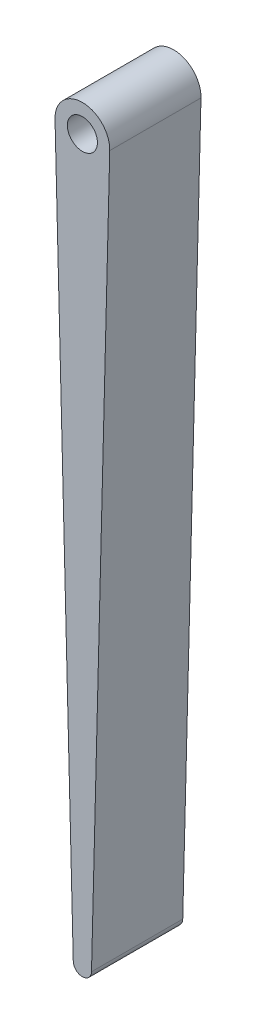
ISO-10303-21;
HEADER;
FILE_DESCRIPTION(('STEP AP214'),'2;1');
FILE_NAME('part.step','',(''),(''),'','','');
FILE_SCHEMA(('AUTOMOTIVE_DESIGN { 1 0 10303 214 1 1 1 1 }'));
ENDSEC;
DATA;
#1=APPLICATION_CONTEXT('core data for automotive mechanical design processes');
#2=APPLICATION_PROTOCOL_DEFINITION('international standard','automotive_design',2000,#1);
#3=PRODUCT_CONTEXT('',#1,'mechanical');
#4=PRODUCT('Part','Part','',(#3));
#5=PRODUCT_RELATED_PRODUCT_CATEGORY('part','',(#4));
#6=PRODUCT_DEFINITION_FORMATION('','',#4);
#7=PRODUCT_DEFINITION_CONTEXT('part definition',#1,'design');
#8=PRODUCT_DEFINITION('design','',#6,#7);
#9=PRODUCT_DEFINITION_SHAPE('','',#8);
#10=(LENGTH_UNIT() NAMED_UNIT(*) SI_UNIT(.MILLI.,.METRE.));
#11=(NAMED_UNIT(*) PLANE_ANGLE_UNIT() SI_UNIT($,.RADIAN.));
#12=(NAMED_UNIT(*) SI_UNIT($,.STERADIAN.) SOLID_ANGLE_UNIT());
#13=UNCERTAINTY_MEASURE_WITH_UNIT(LENGTH_MEASURE(1.E-05),#10,'distance_accuracy_value','');
#14=(GEOMETRIC_REPRESENTATION_CONTEXT(3) GLOBAL_UNCERTAINTY_ASSIGNED_CONTEXT((#13)) GLOBAL_UNIT_ASSIGNED_CONTEXT((#10,
#11,#12)) REPRESENTATION_CONTEXT('',''));
#15=CARTESIAN_POINT('',(0.,0.,0.));
#16=DIRECTION('',(0.,0.,1.));
#17=DIRECTION('',(1.,0.,0.));
#18=AXIS2_PLACEMENT_3D('',#15,#16,#17);
#19=CARTESIAN_POINT('',(0.,0.,20.));
#20=DIRECTION('',(0.,0.,1.));
#21=DIRECTION('',(1.,0.,0.));
#22=AXIS2_PLACEMENT_3D('',#19,#20,#21);
#23=PLANE('',#22);
#24=CARTESIAN_POINT('',(0.,0.,20.));
#25=DIRECTION('',(0.,0.,1.));
#26=DIRECTION('',(1.,0.,0.));
#27=AXIS2_PLACEMENT_3D('',#24,#25,#26);
#28=CIRCLE('',#27,6.);
#29=CARTESIAN_POINT('',(5.99807692302753,-0.151898734177215,20.));
#30=VERTEX_POINT('',#29);
#31=CARTESIAN_POINT('',(-5.99807692302753,-0.151898734177217,20.));
#32=VERTEX_POINT('',#31);
#33=EDGE_CURVE('E91',#30,#32,#28,.T.);
#34=ORIENTED_EDGE('',*,*,#33,.T.);
#35=DIRECTION('',(0.0253164556962027,-0.999679487171254,0.));
#36=VECTOR('',#35,1.);
#37=CARTESIAN_POINT('',(-5.99807692302753,-0.151898734177217,20.));
#38=LINE('',#37,#36);
#39=CARTESIAN_POINT('',(-1.99935897434249,-158.050632911392,20.));
#40=VERTEX_POINT('',#39);
#41=EDGE_CURVE('E86',#32,#40,#38,.T.);
#42=ORIENTED_EDGE('',*,*,#41,.T.);
#43=CARTESIAN_POINT('',(0.,-158.,20.));
#44=DIRECTION('',(0.,0.,1.));
#45=DIRECTION('',(1.,0.,0.));
#46=AXIS2_PLACEMENT_3D('',#43,#44,#45);
#47=CIRCLE('',#46,2.);
#48=CARTESIAN_POINT('',(1.99935897434253,-158.050632911392,20.));
#49=VERTEX_POINT('',#48);
#50=EDGE_CURVE('E89',#40,#49,#47,.T.);
#51=ORIENTED_EDGE('',*,*,#50,.T.);
#52=DIRECTION('',(0.0253164556962024,0.999679487171254,0.));
#53=VECTOR('',#52,1.);
#54=CARTESIAN_POINT('',(5.99807692302753,-0.151898734177215,20.));
#55=LINE('',#54,#53);
#56=EDGE_CURVE('E56',#49,#30,#55,.T.);
#57=ORIENTED_EDGE('',*,*,#56,.T.);
#58=EDGE_LOOP('',(#34,#42,#51,#57));
#59=FACE_BOUND('',#58,.T.);
#60=CARTESIAN_POINT('',(0.,0.,20.));
#61=DIRECTION('',(0.,0.,1.));
#62=DIRECTION('',(1.,0.,0.));
#63=AXIS2_PLACEMENT_3D('',#60,#61,#62);
#64=CIRCLE('',#63,3.3);
#65=CARTESIAN_POINT('',(3.3,0.,20.));
#66=VERTEX_POINT('',#65);
#67=EDGE_CURVE('E106',#66,#66,#64,.T.);
#68=ORIENTED_EDGE('',*,*,#67,.F.);
#69=EDGE_LOOP('',(#68));
#70=FACE_BOUND('',#69,.T.);
#71=ADVANCED_FACE('F39',(#59,#70),#23,.T.);
#72=CARTESIAN_POINT('',(0.,0.,0.));
#73=DIRECTION('',(0.,0.,1.));
#74=DIRECTION('',(1.,0.,0.));
#75=AXIS2_PLACEMENT_3D('',#72,#73,#74);
#76=PLANE('',#75);
#77=CARTESIAN_POINT('',(0.,0.,0.));
#78=DIRECTION('',(0.,0.,1.));
#79=DIRECTION('',(1.,0.,0.));
#80=AXIS2_PLACEMENT_3D('',#77,#78,#79);
#81=CIRCLE('',#80,6.);
#82=CARTESIAN_POINT('',(5.99807692302753,-0.151898734177215,0.));
#83=VERTEX_POINT('',#82);
#84=CARTESIAN_POINT('',(-5.99807692302753,-0.151898734177217,0.));
#85=VERTEX_POINT('',#84);
#86=EDGE_CURVE('E103',#83,#85,#81,.T.);
#87=ORIENTED_EDGE('',*,*,#86,.F.);
#88=DIRECTION('',(0.0253164556962024,0.999679487171254,0.));
#89=VECTOR('',#88,1.);
#90=CARTESIAN_POINT('',(5.99807692302753,-0.151898734177215,0.));
#91=LINE('',#90,#89);
#92=CARTESIAN_POINT('',(1.99935897434253,-158.050632911392,0.));
#93=VERTEX_POINT('',#92);
#94=EDGE_CURVE('E79',#93,#83,#91,.T.);
#95=ORIENTED_EDGE('',*,*,#94,.F.);
#96=CARTESIAN_POINT('',(0.,-158.,0.));
#97=DIRECTION('',(0.,0.,1.));
#98=DIRECTION('',(1.,0.,0.));
#99=AXIS2_PLACEMENT_3D('',#96,#97,#98);
#100=CIRCLE('',#99,2.);
#101=CARTESIAN_POINT('',(-1.99935897434249,-158.050632911392,0.));
#102=VERTEX_POINT('',#101);
#103=EDGE_CURVE('E73',#102,#93,#100,.T.);
#104=ORIENTED_EDGE('',*,*,#103,.F.);
#105=DIRECTION('',(0.0253164556962027,-0.999679487171254,0.));
#106=VECTOR('',#105,1.);
#107=CARTESIAN_POINT('',(-5.99807692302753,-0.151898734177217,0.));
#108=LINE('',#107,#106);
#109=EDGE_CURVE('E95',#85,#102,#108,.T.);
#110=ORIENTED_EDGE('',*,*,#109,.F.);
#111=EDGE_LOOP('',(#87,#95,#104,#110));
#112=FACE_BOUND('',#111,.T.);
#113=CARTESIAN_POINT('',(0.,0.,0.));
#114=DIRECTION('',(0.,0.,1.));
#115=DIRECTION('',(1.,0.,0.));
#116=AXIS2_PLACEMENT_3D('',#113,#114,#115);
#117=CIRCLE('',#116,3.3);
#118=CARTESIAN_POINT('',(3.3,0.,0.));
#119=VERTEX_POINT('',#118);
#120=EDGE_CURVE('E118',#119,#119,#117,.T.);
#121=ORIENTED_EDGE('',*,*,#120,.T.);
#122=EDGE_LOOP('',(#121));
#123=FACE_BOUND('',#122,.T.);
#124=ADVANCED_FACE('F114',(#112,#123),#76,.F.);
#125=CARTESIAN_POINT('',(0.,0.,20.));
#126=DIRECTION('',(0.,0.,-1.));
#127=DIRECTION('',(-1.,0.,0.));
#128=AXIS2_PLACEMENT_3D('',#125,#126,#127);
#129=CYLINDRICAL_SURFACE('',#128,6.);
#130=ORIENTED_EDGE('',*,*,#86,.T.);
#131=DIRECTION('',(0.,0.,-1.));
#132=VECTOR('',#131,1.);
#133=CARTESIAN_POINT('',(-5.99807692302753,-0.151898734177217,20.));
#134=LINE('',#133,#132);
#135=EDGE_CURVE('E11',#32,#85,#134,.T.);
#136=ORIENTED_EDGE('',*,*,#135,.F.);
#137=ORIENTED_EDGE('',*,*,#33,.F.);
#138=DIRECTION('',(0.,0.,-1.));
#139=VECTOR('',#138,1.);
#140=CARTESIAN_POINT('',(5.99807692302753,-0.151898734177215,20.));
#141=LINE('',#140,#139);
#142=EDGE_CURVE('E99',#30,#83,#141,.T.);
#143=ORIENTED_EDGE('',*,*,#142,.T.);
#144=EDGE_LOOP('',(#130,#136,#137,#143));
#145=FACE_BOUND('',#144,.T.);
#146=ADVANCED_FACE('F41',(#145),#129,.T.);
#147=CARTESIAN_POINT('',(-5.99807692302753,-0.151898734177217,20.));
#148=DIRECTION('',(0.999679487171254,0.0253164556962027,0.));
#149=DIRECTION('',(-0.0253164556962027,0.999679487171254,0.));
#150=AXIS2_PLACEMENT_3D('',#147,#148,#149);
#151=PLANE('',#150);
#152=ORIENTED_EDGE('',*,*,#109,.T.);
#153=DIRECTION('',(0.,0.,-1.));
#154=VECTOR('',#153,1.);
#155=CARTESIAN_POINT('',(-1.99935897434249,-158.050632911392,20.));
#156=LINE('',#155,#154);
#157=EDGE_CURVE('E48',#40,#102,#156,.T.);
#158=ORIENTED_EDGE('',*,*,#157,.F.);
#159=ORIENTED_EDGE('',*,*,#41,.F.);
#160=ORIENTED_EDGE('',*,*,#135,.T.);
#161=EDGE_LOOP('',(#152,#158,#159,#160));
#162=FACE_BOUND('',#161,.T.);
#163=ADVANCED_FACE('F94',(#162),#151,.F.);
#164=CARTESIAN_POINT('',(0.,-158.,20.));
#165=DIRECTION('',(0.,0.,-1.));
#166=DIRECTION('',(-1.,0.,0.));
#167=AXIS2_PLACEMENT_3D('',#164,#165,#166);
#168=CYLINDRICAL_SURFACE('',#167,2.);
#169=ORIENTED_EDGE('',*,*,#103,.T.);
#170=DIRECTION('',(0.,0.,-1.));
#171=VECTOR('',#170,1.);
#172=CARTESIAN_POINT('',(1.99935897434253,-158.050632911392,20.));
#173=LINE('',#172,#171);
#174=EDGE_CURVE('E96',#49,#93,#173,.T.);
#175=ORIENTED_EDGE('',*,*,#174,.F.);
#176=ORIENTED_EDGE('',*,*,#50,.F.);
#177=ORIENTED_EDGE('',*,*,#157,.T.);
#178=EDGE_LOOP('',(#169,#175,#176,#177));
#179=FACE_BOUND('',#178,.T.);
#180=ADVANCED_FACE('F97',(#179),#168,.T.);
#181=CARTESIAN_POINT('',(5.99807692302753,-0.151898734177215,20.));
#182=DIRECTION('',(-0.999679487171254,0.0253164556962024,0.));
#183=DIRECTION('',(-0.0253164556962024,-0.999679487171254,0.));
#184=AXIS2_PLACEMENT_3D('',#181,#182,#183);
#185=PLANE('',#184);
#186=ORIENTED_EDGE('',*,*,#94,.T.);
#187=ORIENTED_EDGE('',*,*,#142,.F.);
#188=ORIENTED_EDGE('',*,*,#56,.F.);
#189=ORIENTED_EDGE('',*,*,#174,.T.);
#190=EDGE_LOOP('',(#186,#187,#188,#189));
#191=FACE_BOUND('',#190,.T.);
#192=ADVANCED_FACE('F111',(#191),#185,.F.);
#193=CARTESIAN_POINT('',(0.,0.,20.));
#194=DIRECTION('',(0.,0.,-1.));
#195=DIRECTION('',(-1.,0.,0.));
#196=AXIS2_PLACEMENT_3D('',#193,#194,#195);
#197=CYLINDRICAL_SURFACE('',#196,3.3);
#198=ORIENTED_EDGE('',*,*,#67,.T.);
#199=EDGE_LOOP('',(#198));
#200=FACE_BOUND('',#199,.T.);
#201=ORIENTED_EDGE('',*,*,#120,.F.);
#202=EDGE_LOOP('',(#201));
#203=FACE_BOUND('',#202,.T.);
#204=ADVANCED_FACE('F124',(#200,#203),#197,.F.);
#205=CLOSED_SHELL('',(#71,#124,#146,#163,#180,#192,#204));
#206=MANIFOLD_SOLID_BREP('B2',#205);
#207=ADVANCED_BREP_SHAPE_REPRESENTATION('',(#18,#206),#14);
#208=SHAPE_DEFINITION_REPRESENTATION(#9,#207);
ENDSEC;
END-ISO-10303-21;
